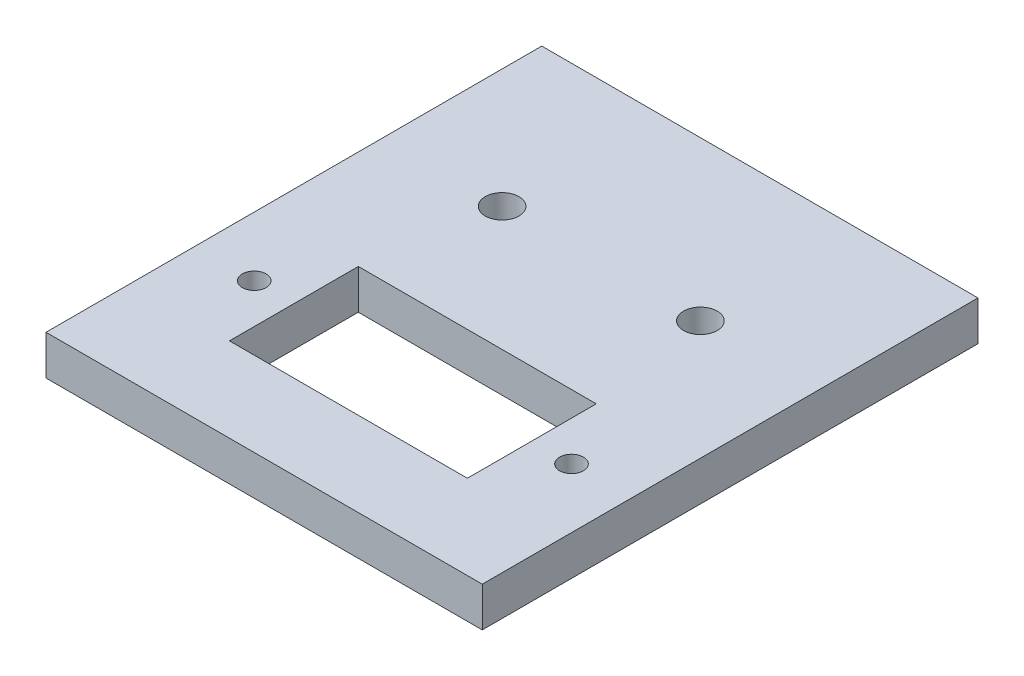
ISO-10303-21;
HEADER;
FILE_DESCRIPTION(('STEP AP214'),'2;1');
FILE_NAME('part.step','',(''),(''),'','','');
FILE_SCHEMA(('AUTOMOTIVE_DESIGN { 1 0 10303 214 1 1 1 1 }'));
ENDSEC;
DATA;
#1=APPLICATION_CONTEXT('core data for automotive mechanical design processes');
#2=APPLICATION_PROTOCOL_DEFINITION('international standard','automotive_design',2000,#1);
#3=PRODUCT_CONTEXT('',#1,'mechanical');
#4=PRODUCT('Part','Part','',(#3));
#5=PRODUCT_RELATED_PRODUCT_CATEGORY('part','',(#4));
#6=PRODUCT_DEFINITION_FORMATION('','',#4);
#7=PRODUCT_DEFINITION_CONTEXT('part definition',#1,'design');
#8=PRODUCT_DEFINITION('design','',#6,#7);
#9=PRODUCT_DEFINITION_SHAPE('','',#8);
#10=(LENGTH_UNIT() NAMED_UNIT(*) SI_UNIT(.MILLI.,.METRE.));
#11=(NAMED_UNIT(*) PLANE_ANGLE_UNIT() SI_UNIT($,.RADIAN.));
#12=(NAMED_UNIT(*) SI_UNIT($,.STERADIAN.) SOLID_ANGLE_UNIT());
#13=UNCERTAINTY_MEASURE_WITH_UNIT(LENGTH_MEASURE(1.E-05),#10,'distance_accuracy_value','');
#14=(GEOMETRIC_REPRESENTATION_CONTEXT(3) GLOBAL_UNCERTAINTY_ASSIGNED_CONTEXT((#13)) GLOBAL_UNIT_ASSIGNED_CONTEXT((#10,
#11,#12)) REPRESENTATION_CONTEXT('',''));
#15=CARTESIAN_POINT('',(0.,0.,0.));
#16=DIRECTION('',(0.,0.,1.));
#17=DIRECTION('',(1.,0.,0.));
#18=AXIS2_PLACEMENT_3D('',#15,#16,#17);
#19=CARTESIAN_POINT('',(16.,-11.,30.));
#20=DIRECTION('',(0.,1.,0.));
#21=DIRECTION('',(1.,0.,0.));
#22=AXIS2_PLACEMENT_3D('',#19,#20,#21);
#23=CYLINDRICAL_SURFACE('',#22,1.2);
#24=CARTESIAN_POINT('',(16.,-14.,30.));
#25=DIRECTION('',(0.,1.,0.));
#26=DIRECTION('',(1.,0.,0.));
#27=AXIS2_PLACEMENT_3D('',#24,#25,#26);
#28=CIRCLE('',#27,1.2);
#29=CARTESIAN_POINT('',(17.2,-14.,30.));
#30=VERTEX_POINT('',#29);
#31=EDGE_CURVE('E142',#30,#30,#28,.T.);
#32=ORIENTED_EDGE('',*,*,#31,.T.);
#33=DIRECTION('',(0.,-1.,0.));
#34=VECTOR('',#33,1.);
#35=CARTESIAN_POINT('',(17.2,-11.,30.));
#36=LINE('',#35,#34);
#37=CARTESIAN_POINT('',(17.2,-18.,30.));
#38=VERTEX_POINT('',#37);
#39=EDGE_CURVE('E9',#30,#38,#36,.T.);
#40=ORIENTED_EDGE('',*,*,#39,.T.);
#41=CARTESIAN_POINT('',(16.,-18.,30.));
#42=DIRECTION('',(0.,1.,0.));
#43=DIRECTION('',(1.,0.,0.));
#44=AXIS2_PLACEMENT_3D('',#41,#42,#43);
#45=CIRCLE('',#44,1.2);
#46=EDGE_CURVE('E220',#38,#38,#45,.T.);
#47=ORIENTED_EDGE('',*,*,#46,.F.);
#48=ORIENTED_EDGE('',*,*,#39,.F.);
#49=EDGE_LOOP('',(#32,#40,#47,#48));
#50=FACE_BOUND('',#49,.T.);
#51=ADVANCED_FACE('F15',(#50),#23,.F.);
#52=CARTESIAN_POINT('',(10.,-11.,11.));
#53=DIRECTION('',(0.,1.,0.));
#54=DIRECTION('',(1.,0.,0.));
#55=AXIS2_PLACEMENT_3D('',#52,#53,#54);
#56=CYLINDRICAL_SURFACE('',#55,1.7);
#57=CARTESIAN_POINT('',(10.,-14.,11.));
#58=DIRECTION('',(0.,1.,0.));
#59=DIRECTION('',(1.,0.,0.));
#60=AXIS2_PLACEMENT_3D('',#57,#58,#59);
#61=CIRCLE('',#60,1.7);
#62=CARTESIAN_POINT('',(11.7,-14.,11.));
#63=VERTEX_POINT('',#62);
#64=EDGE_CURVE('E172',#63,#63,#61,.T.);
#65=ORIENTED_EDGE('',*,*,#64,.T.);
#66=DIRECTION('',(0.,-1.,0.));
#67=VECTOR('',#66,1.);
#68=CARTESIAN_POINT('',(11.7,-11.,11.));
#69=LINE('',#68,#67);
#70=CARTESIAN_POINT('',(11.7,-18.,11.));
#71=VERTEX_POINT('',#70);
#72=EDGE_CURVE('E23',#63,#71,#69,.T.);
#73=ORIENTED_EDGE('',*,*,#72,.T.);
#74=CARTESIAN_POINT('',(10.,-18.,11.));
#75=DIRECTION('',(0.,1.,0.));
#76=DIRECTION('',(1.,0.,0.));
#77=AXIS2_PLACEMENT_3D('',#74,#75,#76);
#78=CIRCLE('',#77,1.7);
#79=EDGE_CURVE('E214',#71,#71,#78,.T.);
#80=ORIENTED_EDGE('',*,*,#79,.F.);
#81=ORIENTED_EDGE('',*,*,#72,.F.);
#82=EDGE_LOOP('',(#65,#73,#80,#81));
#83=FACE_BOUND('',#82,.T.);
#84=ADVANCED_FACE('F213',(#83),#56,.F.);
#85=CARTESIAN_POINT('',(-12.,-20.,23.5));
#86=DIRECTION('',(0.,0.,1.));
#87=DIRECTION('',(1.,0.,0.));
#88=AXIS2_PLACEMENT_3D('',#85,#86,#87);
#89=PLANE('',#88);
#90=DIRECTION('',(0.,1.,0.));
#91=VECTOR('',#90,1.);
#92=CARTESIAN_POINT('',(-12.,-20.,23.5));
#93=LINE('',#92,#91);
#94=CARTESIAN_POINT('',(-12.,-18.,23.5));
#95=VERTEX_POINT('',#94);
#96=CARTESIAN_POINT('',(-12.,-14.,23.5));
#97=VERTEX_POINT('',#96);
#98=EDGE_CURVE('E205',#95,#97,#93,.T.);
#99=ORIENTED_EDGE('',*,*,#98,.F.);
#100=DIRECTION('',(1.,0.,0.));
#101=VECTOR('',#100,1.);
#102=CARTESIAN_POINT('',(-17.,-18.,23.5));
#103=LINE('',#102,#101);
#104=CARTESIAN_POINT('',(12.,-18.,23.5));
#105=VERTEX_POINT('',#104);
#106=EDGE_CURVE('E238',#95,#105,#103,.T.);
#107=ORIENTED_EDGE('',*,*,#106,.T.);
#108=DIRECTION('',(0.,1.,0.));
#109=VECTOR('',#108,1.);
#110=CARTESIAN_POINT('',(12.,-20.,23.5));
#111=LINE('',#110,#109);
#112=CARTESIAN_POINT('',(12.,-14.,23.5));
#113=VERTEX_POINT('',#112);
#114=EDGE_CURVE('E208',#105,#113,#111,.T.);
#115=ORIENTED_EDGE('',*,*,#114,.T.);
#116=DIRECTION('',(1.,0.,0.));
#117=VECTOR('',#116,1.);
#118=CARTESIAN_POINT('',(-17.,-14.,23.5));
#119=LINE('',#118,#117);
#120=EDGE_CURVE('E187',#97,#113,#119,.T.);
#121=ORIENTED_EDGE('',*,*,#120,.F.);
#122=EDGE_LOOP('',(#99,#107,#115,#121));
#123=FACE_BOUND('',#122,.T.);
#124=ADVANCED_FACE('F298',(#123),#89,.T.);
#125=CARTESIAN_POINT('',(12.,-20.,23.5));
#126=DIRECTION('',(1.,0.,0.));
#127=DIRECTION('',(0.,1.,0.));
#128=AXIS2_PLACEMENT_3D('',#125,#126,#127);
#129=PLANE('',#128);
#130=DIRECTION('',(0.,0.,-1.));
#131=VECTOR('',#130,1.);
#132=CARTESIAN_POINT('',(12.,-14.,9.25));
#133=LINE('',#132,#131);
#134=CARTESIAN_POINT('',(12.,-14.,36.5));
#135=VERTEX_POINT('',#134);
#136=EDGE_CURVE('E191',#135,#113,#133,.T.);
#137=ORIENTED_EDGE('',*,*,#136,.T.);
#138=ORIENTED_EDGE('',*,*,#114,.F.);
#139=DIRECTION('',(0.,0.,-1.));
#140=VECTOR('',#139,1.);
#141=CARTESIAN_POINT('',(12.,-18.,9.25));
#142=LINE('',#141,#140);
#143=CARTESIAN_POINT('',(12.,-18.,36.5));
#144=VERTEX_POINT('',#143);
#145=EDGE_CURVE('E246',#144,#105,#142,.T.);
#146=ORIENTED_EDGE('',*,*,#145,.F.);
#147=DIRECTION('',(0.,1.,0.));
#148=VECTOR('',#147,1.);
#149=CARTESIAN_POINT('',(12.,-20.,36.5));
#150=LINE('',#149,#148);
#151=EDGE_CURVE('E199',#144,#135,#150,.T.);
#152=ORIENTED_EDGE('',*,*,#151,.T.);
#153=EDGE_LOOP('',(#137,#138,#146,#152));
#154=FACE_BOUND('',#153,.T.);
#155=ADVANCED_FACE('F336',(#154),#129,.F.);
#156=CARTESIAN_POINT('',(-12.,-20.,23.5));
#157=DIRECTION('',(1.,0.,0.));
#158=DIRECTION('',(0.,1.,0.));
#159=AXIS2_PLACEMENT_3D('',#156,#157,#158);
#160=PLANE('',#159);
#161=DIRECTION('',(0.,1.,0.));
#162=VECTOR('',#161,1.);
#163=CARTESIAN_POINT('',(-12.,-20.,36.5));
#164=LINE('',#163,#162);
#165=CARTESIAN_POINT('',(-12.,-18.,36.5));
#166=VERTEX_POINT('',#165);
#167=CARTESIAN_POINT('',(-12.,-14.,36.5));
#168=VERTEX_POINT('',#167);
#169=EDGE_CURVE('E202',#166,#168,#164,.T.);
#170=ORIENTED_EDGE('',*,*,#169,.F.);
#171=DIRECTION('',(0.,0.,-1.));
#172=VECTOR('',#171,1.);
#173=CARTESIAN_POINT('',(-12.,-18.,9.25));
#174=LINE('',#173,#172);
#175=EDGE_CURVE('E230',#166,#95,#174,.T.);
#176=ORIENTED_EDGE('',*,*,#175,.T.);
#177=ORIENTED_EDGE('',*,*,#98,.T.);
#178=DIRECTION('',(0.,0.,-1.));
#179=VECTOR('',#178,1.);
#180=CARTESIAN_POINT('',(-12.,-14.,9.25));
#181=LINE('',#180,#179);
#182=EDGE_CURVE('E183',#168,#97,#181,.T.);
#183=ORIENTED_EDGE('',*,*,#182,.F.);
#184=EDGE_LOOP('',(#170,#176,#177,#183));
#185=FACE_BOUND('',#184,.T.);
#186=ADVANCED_FACE('F332',(#185),#160,.T.);
#187=CARTESIAN_POINT('',(-12.,-20.,36.5));
#188=DIRECTION('',(0.,0.,1.));
#189=DIRECTION('',(1.,0.,0.));
#190=AXIS2_PLACEMENT_3D('',#187,#188,#189);
#191=PLANE('',#190);
#192=DIRECTION('',(1.,0.,0.));
#193=VECTOR('',#192,1.);
#194=CARTESIAN_POINT('',(-17.,-14.,36.5));
#195=LINE('',#194,#193);
#196=EDGE_CURVE('E176',#168,#135,#195,.T.);
#197=ORIENTED_EDGE('',*,*,#196,.T.);
#198=ORIENTED_EDGE('',*,*,#151,.F.);
#199=DIRECTION('',(1.,0.,0.));
#200=VECTOR('',#199,1.);
#201=CARTESIAN_POINT('',(-17.,-18.,36.5));
#202=LINE('',#201,#200);
#203=EDGE_CURVE('E221',#166,#144,#202,.T.);
#204=ORIENTED_EDGE('',*,*,#203,.F.);
#205=ORIENTED_EDGE('',*,*,#169,.T.);
#206=EDGE_LOOP('',(#197,#198,#204,#205));
#207=FACE_BOUND('',#206,.T.);
#208=ADVANCED_FACE('F322',(#207),#191,.F.);
#209=CARTESIAN_POINT('',(-16.,-11.,30.));
#210=DIRECTION('',(0.,1.,0.));
#211=DIRECTION('',(1.,0.,0.));
#212=AXIS2_PLACEMENT_3D('',#209,#210,#211);
#213=CYLINDRICAL_SURFACE('',#212,1.2);
#214=CARTESIAN_POINT('',(-16.,-14.,30.));
#215=DIRECTION('',(0.,1.,0.));
#216=DIRECTION('',(1.,0.,0.));
#217=AXIS2_PLACEMENT_3D('',#214,#215,#216);
#218=CIRCLE('',#217,1.2);
#219=CARTESIAN_POINT('',(-14.8,-14.,30.));
#220=VERTEX_POINT('',#219);
#221=EDGE_CURVE('E169',#220,#220,#218,.T.);
#222=ORIENTED_EDGE('',*,*,#221,.T.);
#223=DIRECTION('',(0.,-1.,0.));
#224=VECTOR('',#223,1.);
#225=CARTESIAN_POINT('',(-14.8,-11.,30.));
#226=LINE('',#225,#224);
#227=CARTESIAN_POINT('',(-14.8,-18.,30.));
#228=VERTEX_POINT('',#227);
#229=EDGE_CURVE('E179',#220,#228,#226,.T.);
#230=ORIENTED_EDGE('',*,*,#229,.T.);
#231=CARTESIAN_POINT('',(-16.,-18.,30.));
#232=DIRECTION('',(0.,1.,0.));
#233=DIRECTION('',(1.,0.,0.));
#234=AXIS2_PLACEMENT_3D('',#231,#232,#233);
#235=CIRCLE('',#234,1.2);
#236=EDGE_CURVE('E242',#228,#228,#235,.T.);
#237=ORIENTED_EDGE('',*,*,#236,.F.);
#238=ORIENTED_EDGE('',*,*,#229,.F.);
#239=EDGE_LOOP('',(#222,#230,#237,#238));
#240=FACE_BOUND('',#239,.T.);
#241=ADVANCED_FACE('F316',(#240),#213,.F.);
#242=CARTESIAN_POINT('',(-10.,-11.,11.));
#243=DIRECTION('',(0.,1.,0.));
#244=DIRECTION('',(1.,0.,0.));
#245=AXIS2_PLACEMENT_3D('',#242,#243,#244);
#246=CYLINDRICAL_SURFACE('',#245,1.7);
#247=CARTESIAN_POINT('',(-10.,-14.,11.));
#248=DIRECTION('',(0.,1.,0.));
#249=DIRECTION('',(1.,0.,0.));
#250=AXIS2_PLACEMENT_3D('',#247,#248,#249);
#251=CIRCLE('',#250,1.7);
#252=CARTESIAN_POINT('',(-8.3,-14.,11.));
#253=VERTEX_POINT('',#252);
#254=EDGE_CURVE('E152',#253,#253,#251,.T.);
#255=ORIENTED_EDGE('',*,*,#254,.T.);
#256=DIRECTION('',(0.,-1.,0.));
#257=VECTOR('',#256,1.);
#258=CARTESIAN_POINT('',(-8.3,-11.,11.));
#259=LINE('',#258,#257);
#260=CARTESIAN_POINT('',(-8.3,-18.,11.));
#261=VERTEX_POINT('',#260);
#262=EDGE_CURVE('E141',#253,#261,#259,.T.);
#263=ORIENTED_EDGE('',*,*,#262,.T.);
#264=CARTESIAN_POINT('',(-10.,-18.,11.));
#265=DIRECTION('',(0.,1.,0.));
#266=DIRECTION('',(1.,0.,0.));
#267=AXIS2_PLACEMENT_3D('',#264,#265,#266);
#268=CIRCLE('',#267,1.7);
#269=EDGE_CURVE('E247',#261,#261,#268,.T.);
#270=ORIENTED_EDGE('',*,*,#269,.F.);
#271=ORIENTED_EDGE('',*,*,#262,.F.);
#272=EDGE_LOOP('',(#255,#263,#270,#271));
#273=FACE_BOUND('',#272,.T.);
#274=ADVANCED_FACE('F312',(#273),#246,.F.);
#275=CARTESIAN_POINT('',(22.,-18.,-5.));
#276=DIRECTION('',(1.,0.,0.));
#277=DIRECTION('',(0.,1.,0.));
#278=AXIS2_PLACEMENT_3D('',#275,#276,#277);
#279=PLANE('',#278);
#280=DIRECTION('',(0.,0.,1.));
#281=VECTOR('',#280,1.);
#282=CARTESIAN_POINT('',(22.,-18.,-5.));
#283=LINE('',#282,#281);
#284=CARTESIAN_POINT('',(22.,-18.,-5.));
#285=VERTEX_POINT('',#284);
#286=CARTESIAN_POINT('',(22.,-18.,45.));
#287=VERTEX_POINT('',#286);
#288=EDGE_CURVE('E136',#285,#287,#283,.T.);
#289=ORIENTED_EDGE('',*,*,#288,.F.);
#290=DIRECTION('',(0.,1.,0.));
#291=VECTOR('',#290,1.);
#292=CARTESIAN_POINT('',(22.,-18.,-5.));
#293=LINE('',#292,#291);
#294=CARTESIAN_POINT('',(22.,-14.,-5.));
#295=VERTEX_POINT('',#294);
#296=EDGE_CURVE('E130',#285,#295,#293,.T.);
#297=ORIENTED_EDGE('',*,*,#296,.T.);
#298=DIRECTION('',(0.,0.,1.));
#299=VECTOR('',#298,1.);
#300=CARTESIAN_POINT('',(22.,-14.,-5.));
#301=LINE('',#300,#299);
#302=CARTESIAN_POINT('',(22.,-14.,45.));
#303=VERTEX_POINT('',#302);
#304=EDGE_CURVE('E133',#295,#303,#301,.T.);
#305=ORIENTED_EDGE('',*,*,#304,.T.);
#306=DIRECTION('',(0.,1.,0.));
#307=VECTOR('',#306,1.);
#308=CARTESIAN_POINT('',(22.,-18.,45.));
#309=LINE('',#308,#307);
#310=EDGE_CURVE('E162',#287,#303,#309,.T.);
#311=ORIENTED_EDGE('',*,*,#310,.F.);
#312=EDGE_LOOP('',(#289,#297,#305,#311));
#313=FACE_BOUND('',#312,.T.);
#314=ADVANCED_FACE('F132',(#313),#279,.T.);
#315=CARTESIAN_POINT('',(-22.,-18.,-5.));
#316=DIRECTION('',(0.,0.,1.));
#317=DIRECTION('',(1.,0.,0.));
#318=AXIS2_PLACEMENT_3D('',#315,#316,#317);
#319=PLANE('',#318);
#320=DIRECTION('',(1.,0.,0.));
#321=VECTOR('',#320,1.);
#322=CARTESIAN_POINT('',(-22.,-14.,-5.));
#323=LINE('',#322,#321);
#324=CARTESIAN_POINT('',(-22.,-14.,-5.));
#325=VERTEX_POINT('',#324);
#326=EDGE_CURVE('E147',#325,#295,#323,.T.);
#327=ORIENTED_EDGE('',*,*,#326,.T.);
#328=ORIENTED_EDGE('',*,*,#296,.F.);
#329=DIRECTION('',(1.,0.,0.));
#330=VECTOR('',#329,1.);
#331=CARTESIAN_POINT('',(-22.,-18.,-5.));
#332=LINE('',#331,#330);
#333=CARTESIAN_POINT('',(-22.,-18.,-5.));
#334=VERTEX_POINT('',#333);
#335=EDGE_CURVE('E251',#334,#285,#332,.T.);
#336=ORIENTED_EDGE('',*,*,#335,.F.);
#337=DIRECTION('',(0.,1.,0.));
#338=VECTOR('',#337,1.);
#339=CARTESIAN_POINT('',(-22.,-18.,-5.));
#340=LINE('',#339,#338);
#341=EDGE_CURVE('E156',#334,#325,#340,.T.);
#342=ORIENTED_EDGE('',*,*,#341,.T.);
#343=EDGE_LOOP('',(#327,#328,#336,#342));
#344=FACE_BOUND('',#343,.T.);
#345=ADVANCED_FACE('F154',(#344),#319,.F.);
#346=CARTESIAN_POINT('',(-22.,-14.,-5.));
#347=DIRECTION('',(0.,1.,0.));
#348=DIRECTION('',(1.,0.,0.));
#349=AXIS2_PLACEMENT_3D('',#346,#347,#348);
#350=PLANE('',#349);
#351=ORIENTED_EDGE('',*,*,#31,.F.);
#352=EDGE_LOOP('',(#351));
#353=FACE_BOUND('',#352,.T.);
#354=ORIENTED_EDGE('',*,*,#64,.F.);
#355=EDGE_LOOP('',(#354));
#356=FACE_BOUND('',#355,.T.);
#357=ORIENTED_EDGE('',*,*,#196,.F.);
#358=ORIENTED_EDGE('',*,*,#182,.T.);
#359=ORIENTED_EDGE('',*,*,#120,.T.);
#360=ORIENTED_EDGE('',*,*,#136,.F.);
#361=EDGE_LOOP('',(#357,#358,#359,#360));
#362=FACE_BOUND('',#361,.T.);
#363=ORIENTED_EDGE('',*,*,#221,.F.);
#364=EDGE_LOOP('',(#363));
#365=FACE_BOUND('',#364,.T.);
#366=ORIENTED_EDGE('',*,*,#254,.F.);
#367=EDGE_LOOP('',(#366));
#368=FACE_BOUND('',#367,.T.);
#369=ORIENTED_EDGE('',*,*,#326,.F.);
#370=DIRECTION('',(0.,0.,1.));
#371=VECTOR('',#370,1.);
#372=CARTESIAN_POINT('',(-22.,-14.,-5.));
#373=LINE('',#372,#371);
#374=CARTESIAN_POINT('',(-22.,-14.,45.));
#375=VERTEX_POINT('',#374);
#376=EDGE_CURVE('E277',#325,#375,#373,.T.);
#377=ORIENTED_EDGE('',*,*,#376,.T.);
#378=DIRECTION('',(1.,0.,0.));
#379=VECTOR('',#378,1.);
#380=CARTESIAN_POINT('',(-22.,-14.,45.));
#381=LINE('',#380,#379);
#382=EDGE_CURVE('E149',#375,#303,#381,.T.);
#383=ORIENTED_EDGE('',*,*,#382,.T.);
#384=ORIENTED_EDGE('',*,*,#304,.F.);
#385=EDGE_LOOP('',(#369,#377,#383,#384));
#386=FACE_BOUND('',#385,.T.);
#387=ADVANCED_FACE('F145',(#353,#356,#362,#365,#368,#386),#350,.T.);
#388=CARTESIAN_POINT('',(-22.,-18.,45.));
#389=DIRECTION('',(0.,0.,1.));
#390=DIRECTION('',(1.,0.,0.));
#391=AXIS2_PLACEMENT_3D('',#388,#389,#390);
#392=PLANE('',#391);
#393=DIRECTION('',(0.,1.,0.));
#394=VECTOR('',#393,1.);
#395=CARTESIAN_POINT('',(-22.,-18.,45.));
#396=LINE('',#395,#394);
#397=CARTESIAN_POINT('',(-22.,-18.,45.));
#398=VERTEX_POINT('',#397);
#399=EDGE_CURVE('E267',#398,#375,#396,.T.);
#400=ORIENTED_EDGE('',*,*,#399,.F.);
#401=DIRECTION('',(1.,0.,0.));
#402=VECTOR('',#401,1.);
#403=CARTESIAN_POINT('',(-22.,-18.,45.));
#404=LINE('',#403,#402);
#405=EDGE_CURVE('E240',#398,#287,#404,.T.);
#406=ORIENTED_EDGE('',*,*,#405,.T.);
#407=ORIENTED_EDGE('',*,*,#310,.T.);
#408=ORIENTED_EDGE('',*,*,#382,.F.);
#409=EDGE_LOOP('',(#400,#406,#407,#408));
#410=FACE_BOUND('',#409,.T.);
#411=ADVANCED_FACE('F265',(#410),#392,.T.);
#412=CARTESIAN_POINT('',(-22.,-18.,-5.));
#413=DIRECTION('',(0.,1.,0.));
#414=DIRECTION('',(1.,0.,0.));
#415=AXIS2_PLACEMENT_3D('',#412,#413,#414);
#416=PLANE('',#415);
#417=ORIENTED_EDGE('',*,*,#46,.T.);
#418=EDGE_LOOP('',(#417));
#419=FACE_BOUND('',#418,.T.);
#420=ORIENTED_EDGE('',*,*,#79,.T.);
#421=EDGE_LOOP('',(#420));
#422=FACE_BOUND('',#421,.T.);
#423=ORIENTED_EDGE('',*,*,#145,.T.);
#424=ORIENTED_EDGE('',*,*,#106,.F.);
#425=ORIENTED_EDGE('',*,*,#175,.F.);
#426=ORIENTED_EDGE('',*,*,#203,.T.);
#427=EDGE_LOOP('',(#423,#424,#425,#426));
#428=FACE_BOUND('',#427,.T.);
#429=ORIENTED_EDGE('',*,*,#236,.T.);
#430=EDGE_LOOP('',(#429));
#431=FACE_BOUND('',#430,.T.);
#432=ORIENTED_EDGE('',*,*,#269,.T.);
#433=EDGE_LOOP('',(#432));
#434=FACE_BOUND('',#433,.T.);
#435=ORIENTED_EDGE('',*,*,#288,.T.);
#436=ORIENTED_EDGE('',*,*,#405,.F.);
#437=DIRECTION('',(0.,0.,1.));
#438=VECTOR('',#437,1.);
#439=CARTESIAN_POINT('',(-22.,-18.,-5.));
#440=LINE('',#439,#438);
#441=EDGE_CURVE('E234',#334,#398,#440,.T.);
#442=ORIENTED_EDGE('',*,*,#441,.F.);
#443=ORIENTED_EDGE('',*,*,#335,.T.);
#444=EDGE_LOOP('',(#435,#436,#442,#443));
#445=FACE_BOUND('',#444,.T.);
#446=ADVANCED_FACE('F217',(#419,#422,#428,#431,#434,#445),#416,.F.);
#447=CARTESIAN_POINT('',(-22.,-18.,-5.));
#448=DIRECTION('',(1.,0.,0.));
#449=DIRECTION('',(0.,1.,0.));
#450=AXIS2_PLACEMENT_3D('',#447,#448,#449);
#451=PLANE('',#450);
#452=ORIENTED_EDGE('',*,*,#399,.T.);
#453=ORIENTED_EDGE('',*,*,#376,.F.);
#454=ORIENTED_EDGE('',*,*,#341,.F.);
#455=ORIENTED_EDGE('',*,*,#441,.T.);
#456=EDGE_LOOP('',(#452,#453,#454,#455));
#457=FACE_BOUND('',#456,.T.);
#458=ADVANCED_FACE('F284',(#457),#451,.F.);
#459=CLOSED_SHELL('',(#51,#84,#124,#155,#186,#208,#241,#274,#314,#345,#387,#411,#446,#458));
#460=MANIFOLD_SOLID_BREP('B1',#459);
#461=ADVANCED_BREP_SHAPE_REPRESENTATION('',(#18,#460),#14);
#462=SHAPE_DEFINITION_REPRESENTATION(#9,#461);
ENDSEC;
END-ISO-10303-21;
